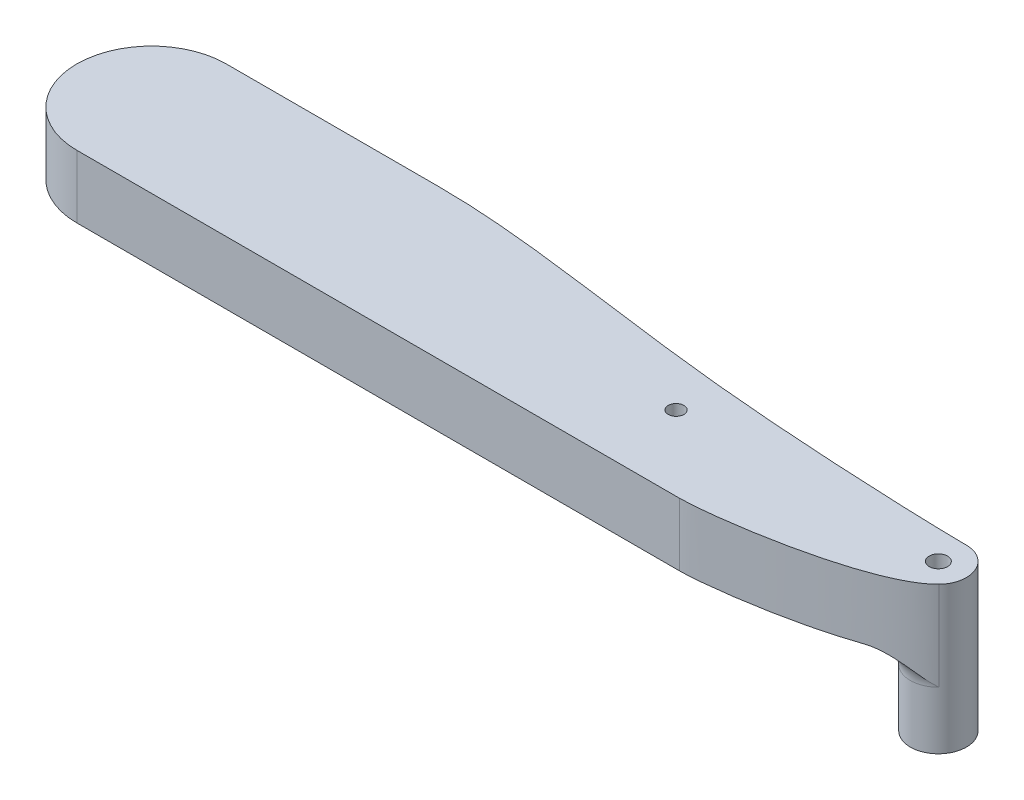
ISO-10303-21;
HEADER;
FILE_DESCRIPTION(('STEP AP214'),'2;1');
FILE_NAME('part.step','',(''),(''),'','','');
FILE_SCHEMA(('AUTOMOTIVE_DESIGN { 1 0 10303 214 1 1 1 1 }'));
ENDSEC;
DATA;
#1=APPLICATION_CONTEXT('core data for automotive mechanical design processes');
#2=APPLICATION_PROTOCOL_DEFINITION('international standard','automotive_design',2000,#1);
#3=PRODUCT_CONTEXT('',#1,'mechanical');
#4=PRODUCT('Part','Part','',(#3));
#5=PRODUCT_RELATED_PRODUCT_CATEGORY('part','',(#4));
#6=PRODUCT_DEFINITION_FORMATION('','',#4);
#7=PRODUCT_DEFINITION_CONTEXT('part definition',#1,'design');
#8=PRODUCT_DEFINITION('design','',#6,#7);
#9=PRODUCT_DEFINITION_SHAPE('','',#8);
#10=(LENGTH_UNIT() NAMED_UNIT(*) SI_UNIT(.MILLI.,.METRE.));
#11=(NAMED_UNIT(*) PLANE_ANGLE_UNIT() SI_UNIT($,.RADIAN.));
#12=(NAMED_UNIT(*) SI_UNIT($,.STERADIAN.) SOLID_ANGLE_UNIT());
#13=UNCERTAINTY_MEASURE_WITH_UNIT(LENGTH_MEASURE(1.E-05),#10,'distance_accuracy_value','');
#14=(GEOMETRIC_REPRESENTATION_CONTEXT(3) GLOBAL_UNCERTAINTY_ASSIGNED_CONTEXT((#13)) GLOBAL_UNIT_ASSIGNED_CONTEXT((#10,
#11,#12)) REPRESENTATION_CONTEXT('',''));
#15=CARTESIAN_POINT('',(0.,0.,0.));
#16=DIRECTION('',(0.,0.,1.));
#17=DIRECTION('',(1.,0.,0.));
#18=AXIS2_PLACEMENT_3D('',#15,#16,#17);
#19=CARTESIAN_POINT('',(-75.,12.,14.25));
#20=DIRECTION('',(0.,0.,-1.));
#21=DIRECTION('',(-1.,0.,0.));
#22=AXIS2_PLACEMENT_3D('',#19,#20,#21);
#23=PLANE('',#22);
#24=DIRECTION('',(0.,-1.,0.));
#25=VECTOR('',#24,1.);
#26=CARTESIAN_POINT('',(39.9337685956905,12.001,14.25));
#27=LINE('',#26,#25);
#28=CARTESIAN_POINT('',(39.9337685956905,12.,14.25));
#29=VERTEX_POINT('',#28);
#30=CARTESIAN_POINT('',(39.9337685956905,0.,14.25));
#31=VERTEX_POINT('',#30);
#32=EDGE_CURVE('E119',#29,#31,#27,.T.);
#33=ORIENTED_EDGE('',*,*,#32,.F.);
#34=DIRECTION('',(1.,0.,0.));
#35=VECTOR('',#34,1.);
#36=CARTESIAN_POINT('',(-75.,12.,14.25));
#37=LINE('',#36,#35);
#38=CARTESIAN_POINT('',(-75.,12.,14.25));
#39=VERTEX_POINT('',#38);
#40=EDGE_CURVE('E139',#39,#29,#37,.T.);
#41=ORIENTED_EDGE('',*,*,#40,.F.);
#42=DIRECTION('',(0.,-1.,0.));
#43=VECTOR('',#42,1.);
#44=CARTESIAN_POINT('',(-75.,12.,14.25));
#45=LINE('',#44,#43);
#46=CARTESIAN_POINT('',(-75.,0.,14.25));
#47=VERTEX_POINT('',#46);
#48=EDGE_CURVE('E143',#39,#47,#45,.T.);
#49=ORIENTED_EDGE('',*,*,#48,.T.);
#50=DIRECTION('',(1.,0.,0.));
#51=VECTOR('',#50,1.);
#52=CARTESIAN_POINT('',(-75.,0.,14.25));
#53=LINE('',#52,#51);
#54=EDGE_CURVE('E153',#47,#31,#53,.T.);
#55=ORIENTED_EDGE('',*,*,#54,.T.);
#56=EDGE_LOOP('',(#33,#41,#49,#55));
#57=FACE_BOUND('',#56,.T.);
#58=ADVANCED_FACE('F45',(#57),#23,.F.);
#59=CARTESIAN_POINT('',(-75.,12.,-14.25));
#60=DIRECTION('',(0.,0.,-1.));
#61=DIRECTION('',(-1.,0.,0.));
#62=AXIS2_PLACEMENT_3D('',#59,#60,#61);
#63=PLANE('',#62);
#64=DIRECTION('',(1.,0.,0.));
#65=VECTOR('',#64,1.);
#66=CARTESIAN_POINT('',(-75.,12.,-14.25));
#67=LINE('',#66,#65);
#68=CARTESIAN_POINT('',(-75.,12.,-14.25));
#69=VERTEX_POINT('',#68);
#70=CARTESIAN_POINT('',(-34.5980224377259,12.,-14.25));
#71=VERTEX_POINT('',#70);
#72=EDGE_CURVE('E129',#69,#71,#67,.T.);
#73=ORIENTED_EDGE('',*,*,#72,.T.);
#74=DIRECTION('',(0.,-1.,0.));
#75=VECTOR('',#74,1.);
#76=CARTESIAN_POINT('',(-34.5980224377259,12.001,-14.25));
#77=LINE('',#76,#75);
#78=CARTESIAN_POINT('',(-34.5980224377259,0.,-14.25));
#79=VERTEX_POINT('',#78);
#80=EDGE_CURVE('E108',#71,#79,#77,.T.);
#81=ORIENTED_EDGE('',*,*,#80,.T.);
#82=DIRECTION('',(1.,0.,0.));
#83=VECTOR('',#82,1.);
#84=CARTESIAN_POINT('',(-75.,0.,-14.25));
#85=LINE('',#84,#83);
#86=CARTESIAN_POINT('',(-75.,0.,-14.25));
#87=VERTEX_POINT('',#86);
#88=EDGE_CURVE('E158',#87,#79,#85,.T.);
#89=ORIENTED_EDGE('',*,*,#88,.F.);
#90=DIRECTION('',(0.,-1.,0.));
#91=VECTOR('',#90,1.);
#92=CARTESIAN_POINT('',(-75.,12.,-14.25));
#93=LINE('',#92,#91);
#94=EDGE_CURVE('E136',#69,#87,#93,.T.);
#95=ORIENTED_EDGE('',*,*,#94,.F.);
#96=EDGE_LOOP('',(#73,#81,#89,#95));
#97=FACE_BOUND('',#96,.T.);
#98=ADVANCED_FACE('F135',(#97),#63,.T.);
#99=CARTESIAN_POINT('',(-75.,0.,0.));
#100=DIRECTION('',(0.,1.,0.));
#101=DIRECTION('',(0.,0.,1.));
#102=AXIS2_PLACEMENT_3D('',#99,#100,#101);
#103=PLANE('',#102);
#104=CARTESIAN_POINT('',(25.,0.,0.));
#105=DIRECTION('',(0.,1.,0.));
#106=DIRECTION('',(0.,0.,1.));
#107=AXIS2_PLACEMENT_3D('',#104,#105,#106);
#108=CIRCLE('',#107,1.5);
#109=CARTESIAN_POINT('',(25.,0.,1.5));
#110=VERTEX_POINT('',#109);
#111=EDGE_CURVE('E154',#110,#110,#108,.T.);
#112=ORIENTED_EDGE('',*,*,#111,.T.);
#113=EDGE_LOOP('',(#112));
#114=FACE_BOUND('',#113,.T.);
#115=CARTESIAN_POINT('',(-34.5980224377259,0.,-14.25));
#116=CARTESIAN_POINT('',(-16.7114247665398,0.,-14.25));
#117=CARTESIAN_POINT('',(16.9697721095391,0.,-7.11576395128839));
#118=CARTESIAN_POINT('',(68.5171140852767,0.,-5.35000000000002));
#119=CARTESIAN_POINT('',(75.,0.,-5.35000000000002));
#120=B_SPLINE_CURVE_WITH_KNOTS('',3,(#115,#116,#117,#118,#119),.UNSPECIFIED.,.F.,.F.,(4,1,4),
(0.,0.557363476483602,1.),.UNSPECIFIED.);
#121=CARTESIAN_POINT('',(66.2551672184016,0.,-5.53628030557362));
#122=VERTEX_POINT('',#121);
#123=EDGE_CURVE('E113',#79,#122,#120,.T.);
#124=ORIENTED_EDGE('',*,*,#123,.T.);
#125=CARTESIAN_POINT('',(75.,0.,0.));
#126=DIRECTION('',(0.,1.,0.));
#127=DIRECTION('',(0.,0.,1.));
#128=AXIS2_PLACEMENT_3D('',#125,#126,#127);
#129=CIRCLE('',#128,10.35);
#130=CARTESIAN_POINT('',(69.4691233137273,0.,8.74825142992844));
#131=VERTEX_POINT('',#130);
#132=EDGE_CURVE('E73',#122,#131,#129,.T.);
#133=ORIENTED_EDGE('',*,*,#132,.T.);
#134=CARTESIAN_POINT('',(78.8479561308971,0.,3.71695219429728));
#135=CARTESIAN_POINT('',(76.072393782244,0.,6.5903392054546));
#136=CARTESIAN_POINT('',(61.3499696988219,0.,12.0828531777784));
#137=CARTESIAN_POINT('',(43.7106323264205,0.,14.25));
#138=CARTESIAN_POINT('',(39.9337685956905,0.,14.25));
#139=B_SPLINE_CURVE_WITH_KNOTS('',3,(#134,#135,#136,#137,#138),.UNSPECIFIED.,.F.,.F.,(4,1,4),
(0.,0.424659955547958,1.),.UNSPECIFIED.);
#140=EDGE_CURVE('E190',#131,#31,#139,.T.);
#141=ORIENTED_EDGE('',*,*,#140,.T.);
#142=ORIENTED_EDGE('',*,*,#54,.F.);
#143=CARTESIAN_POINT('',(-75.,0.,0.));
#144=DIRECTION('',(0.,1.,0.));
#145=DIRECTION('',(0.,0.,1.));
#146=AXIS2_PLACEMENT_3D('',#143,#144,#145);
#147=CIRCLE('',#146,14.25);
#148=EDGE_CURVE('E149',#87,#47,#147,.T.);
#149=ORIENTED_EDGE('',*,*,#148,.F.);
#150=ORIENTED_EDGE('',*,*,#88,.T.);
#151=EDGE_LOOP('',(#124,#133,#141,#142,#149,#150));
#152=FACE_BOUND('',#151,.T.);
#153=ADVANCED_FACE('F270',(#114,#152),#103,.F.);
#154=CARTESIAN_POINT('',(-75.,12.,0.));
#155=DIRECTION('',(0.,-1.,0.));
#156=DIRECTION('',(0.,0.,-1.));
#157=AXIS2_PLACEMENT_3D('',#154,#155,#156);
#158=CYLINDRICAL_SURFACE('',#157,14.25);
#159=ORIENTED_EDGE('',*,*,#148,.T.);
#160=ORIENTED_EDGE('',*,*,#48,.F.);
#161=CARTESIAN_POINT('',(-75.,12.,0.));
#162=DIRECTION('',(0.,1.,0.));
#163=DIRECTION('',(0.,0.,1.));
#164=AXIS2_PLACEMENT_3D('',#161,#162,#163);
#165=CIRCLE('',#164,14.25);
#166=EDGE_CURVE('E145',#69,#39,#165,.T.);
#167=ORIENTED_EDGE('',*,*,#166,.F.);
#168=ORIENTED_EDGE('',*,*,#94,.T.);
#169=EDGE_LOOP('',(#159,#160,#167,#168));
#170=FACE_BOUND('',#169,.T.);
#171=ADVANCED_FACE('F239',(#170),#158,.T.);
#172=CARTESIAN_POINT('',(-75.,12.,0.));
#173=DIRECTION('',(0.,1.,0.));
#174=DIRECTION('',(0.,0.,1.));
#175=AXIS2_PLACEMENT_3D('',#172,#173,#174);
#176=PLANE('',#175);
#177=ORIENTED_EDGE('',*,*,#40,.T.);
#178=CARTESIAN_POINT('',(78.8479561308971,12.,3.71695219429728));
#179=CARTESIAN_POINT('',(76.072393782244,12.,6.5903392054546));
#180=CARTESIAN_POINT('',(61.3499696988219,12.,12.0828531777784));
#181=CARTESIAN_POINT('',(43.7106323264205,12.,14.25));
#182=CARTESIAN_POINT('',(39.9337685956905,12.,14.25));
#183=B_SPLINE_CURVE_WITH_KNOTS('',3,(#178,#179,#180,#181,#182),.UNSPECIFIED.,.F.,.F.,(4,1,4),
(0.,0.424659955547958,1.),.UNSPECIFIED.);
#184=CARTESIAN_POINT('',(78.8479561308971,12.,3.71695219429727));
#185=VERTEX_POINT('',#184);
#186=EDGE_CURVE('E133',#185,#29,#183,.T.);
#187=ORIENTED_EDGE('',*,*,#186,.F.);
#188=CARTESIAN_POINT('',(75.,12.,0.));
#189=DIRECTION('',(0.,1.,0.));
#190=DIRECTION('',(0.,0.,1.));
#191=AXIS2_PLACEMENT_3D('',#188,#189,#190);
#192=CIRCLE('',#191,5.35);
#193=CARTESIAN_POINT('',(75.,12.,-5.35000000000002));
#194=VERTEX_POINT('',#193);
#195=EDGE_CURVE('E131',#185,#194,#192,.T.);
#196=ORIENTED_EDGE('',*,*,#195,.T.);
#197=CARTESIAN_POINT('',(-34.5980224377259,12.,-14.25));
#198=CARTESIAN_POINT('',(-16.7114247665398,12.,-14.25));
#199=CARTESIAN_POINT('',(16.9697721095391,12.,-7.11576395128839));
#200=CARTESIAN_POINT('',(68.5171140852767,12.,-5.35000000000002));
#201=CARTESIAN_POINT('',(75.,12.,-5.35000000000002));
#202=B_SPLINE_CURVE_WITH_KNOTS('',3,(#197,#198,#199,#200,#201),.UNSPECIFIED.,.F.,.F.,(4,1,4),
(0.,0.557363476483602,1.),.UNSPECIFIED.);
#203=EDGE_CURVE('E111',#71,#194,#202,.T.);
#204=ORIENTED_EDGE('',*,*,#203,.F.);
#205=ORIENTED_EDGE('',*,*,#72,.F.);
#206=ORIENTED_EDGE('',*,*,#166,.T.);
#207=EDGE_LOOP('',(#177,#187,#196,#204,#205,#206));
#208=FACE_BOUND('',#207,.T.);
#209=CARTESIAN_POINT('',(75.,12.,0.));
#210=DIRECTION('',(0.,1.,0.));
#211=DIRECTION('',(0.,0.,1.));
#212=AXIS2_PLACEMENT_3D('',#209,#210,#211);
#213=CIRCLE('',#212,1.75);
#214=CARTESIAN_POINT('',(75.,12.,1.74999999999997));
#215=VERTEX_POINT('',#214);
#216=EDGE_CURVE('E218',#215,#215,#213,.F.);
#217=ORIENTED_EDGE('',*,*,#216,.T.);
#218=EDGE_LOOP('',(#217));
#219=FACE_BOUND('',#218,.T.);
#220=CARTESIAN_POINT('',(25.,12.,0.));
#221=DIRECTION('',(0.,1.,0.));
#222=DIRECTION('',(0.,0.,1.));
#223=AXIS2_PLACEMENT_3D('',#220,#221,#222);
#224=CIRCLE('',#223,1.5);
#225=CARTESIAN_POINT('',(25.,12.,1.5));
#226=VERTEX_POINT('',#225);
#227=EDGE_CURVE('E230',#226,#226,#224,.T.);
#228=ORIENTED_EDGE('',*,*,#227,.F.);
#229=EDGE_LOOP('',(#228));
#230=FACE_BOUND('',#229,.T.);
#231=ADVANCED_FACE('F126',(#208,#219,#230),#176,.T.);
#232=CARTESIAN_POINT('',(25.,0.,0.));
#233=DIRECTION('',(0.,1.,0.));
#234=DIRECTION('',(0.,0.,1.));
#235=AXIS2_PLACEMENT_3D('',#232,#233,#234);
#236=CYLINDRICAL_SURFACE('',#235,1.5);
#237=ORIENTED_EDGE('',*,*,#111,.F.);
#238=EDGE_LOOP('',(#237));
#239=FACE_BOUND('',#238,.T.);
#240=ORIENTED_EDGE('',*,*,#227,.T.);
#241=EDGE_LOOP('',(#240));
#242=FACE_BOUND('',#241,.T.);
#243=ADVANCED_FACE('F278',(#239,#242),#236,.F.);
#244=CARTESIAN_POINT('',(75.,-16.,0.));
#245=DIRECTION('',(0.,1.,0.));
#246=DIRECTION('',(0.,0.,1.));
#247=AXIS2_PLACEMENT_3D('',#244,#245,#246);
#248=CYLINDRICAL_SURFACE('',#247,5.35);
#249=CARTESIAN_POINT('',(75.,-16.,0.));
#250=DIRECTION('',(0.,-1.,0.));
#251=DIRECTION('',(0.,0.,-1.));
#252=AXIS2_PLACEMENT_3D('',#249,#250,#251);
#253=CIRCLE('',#252,5.35);
#254=CARTESIAN_POINT('',(75.,-16.,-5.35000000000002));
#255=VERTEX_POINT('',#254);
#256=EDGE_CURVE('E223',#255,#255,#253,.T.);
#257=ORIENTED_EDGE('',*,*,#256,.F.);
#258=EDGE_LOOP('',(#257));
#259=FACE_BOUND('',#258,.T.);
#260=CARTESIAN_POINT('',(75.,-5.,0.));
#261=DIRECTION('',(0.,1.,0.));
#262=DIRECTION('',(0.,0.,1.));
#263=AXIS2_PLACEMENT_3D('',#260,#261,#262);
#264=CIRCLE('',#263,5.35);
#265=CARTESIAN_POINT('',(78.8479561308971,-5.,3.71695219429727));
#266=VERTEX_POINT('',#265);
#267=CARTESIAN_POINT('',(75.,-5.,-5.35000000000002));
#268=VERTEX_POINT('',#267);
#269=EDGE_CURVE('E164',#266,#268,#264,.F.);
#270=ORIENTED_EDGE('',*,*,#269,.T.);
#271=DIRECTION('',(0.,-1.,0.));
#272=VECTOR('',#271,1.);
#273=CARTESIAN_POINT('',(75.,12.001,-5.35000000000002));
#274=LINE('',#273,#272);
#275=EDGE_CURVE('E120',#194,#268,#274,.T.);
#276=ORIENTED_EDGE('',*,*,#275,.F.);
#277=ORIENTED_EDGE('',*,*,#195,.F.);
#278=DIRECTION('',(0.,-1.,0.));
#279=VECTOR('',#278,1.);
#280=CARTESIAN_POINT('',(78.8479561308971,12.001,3.71695219429727));
#281=LINE('',#280,#279);
#282=EDGE_CURVE('E205',#185,#266,#281,.T.);
#283=ORIENTED_EDGE('',*,*,#282,.T.);
#284=EDGE_LOOP('',(#270,#276,#277,#283));
#285=FACE_BOUND('',#284,.T.);
#286=ADVANCED_FACE('F259',(#259,#285),#248,.T.);
#287=CARTESIAN_POINT('',(75.,-16.,0.));
#288=DIRECTION('',(0.,-1.,0.));
#289=DIRECTION('',(0.,0.,-1.));
#290=AXIS2_PLACEMENT_3D('',#287,#288,#289);
#291=PLANE('',#290);
#292=CARTESIAN_POINT('',(75.,-16.,0.));
#293=DIRECTION('',(0.,-1.,0.));
#294=DIRECTION('',(0.,0.,-1.));
#295=AXIS2_PLACEMENT_3D('',#292,#293,#294);
#296=CIRCLE('',#295,1.75);
#297=CARTESIAN_POINT('',(75.,-16.,-1.75000000000002));
#298=VERTEX_POINT('',#297);
#299=EDGE_CURVE('E219',#298,#298,#296,.T.);
#300=ORIENTED_EDGE('',*,*,#299,.F.);
#301=EDGE_LOOP('',(#300));
#302=FACE_BOUND('',#301,.T.);
#303=ORIENTED_EDGE('',*,*,#256,.T.);
#304=EDGE_LOOP('',(#303));
#305=FACE_BOUND('',#304,.T.);
#306=ADVANCED_FACE('F289',(#302,#305),#291,.T.);
#307=CARTESIAN_POINT('',(75.,12.001,0.));
#308=DIRECTION('',(0.,-1.,0.));
#309=DIRECTION('',(0.,0.,-1.));
#310=AXIS2_PLACEMENT_3D('',#307,#308,#309);
#311=CYLINDRICAL_SURFACE('',#310,1.75);
#312=ORIENTED_EDGE('',*,*,#216,.F.);
#313=EDGE_LOOP('',(#312));
#314=FACE_BOUND('',#313,.T.);
#315=ORIENTED_EDGE('',*,*,#299,.T.);
#316=EDGE_LOOP('',(#315));
#317=FACE_BOUND('',#316,.T.);
#318=ADVANCED_FACE('F292',(#314,#317),#311,.F.);
#319=CARTESIAN_POINT('',(78.8479561308971,12.001,3.71695219429728));
#320=CARTESIAN_POINT('',(76.072393782244,12.001,6.5903392054546));
#321=CARTESIAN_POINT('',(61.3499696988219,12.001,12.0828531777784));
#322=CARTESIAN_POINT('',(43.7106323264205,12.001,14.25));
#323=CARTESIAN_POINT('',(39.9337685956905,12.001,14.25));
#324=B_SPLINE_CURVE_WITH_KNOTS('',3,(#319,#320,#321,#322,#323),.UNSPECIFIED.,.F.,.F.,(4,1,4),
(0.,0.424659955547958,1.),.UNSPECIFIED.);
#325=DIRECTION('',(0.,-1.,0.));
#326=VECTOR('',#325,1.);
#327=SURFACE_OF_LINEAR_EXTRUSION('',#324,#326);
#328=ORIENTED_EDGE('',*,*,#186,.T.);
#329=ORIENTED_EDGE('',*,*,#32,.T.);
#330=ORIENTED_EDGE('',*,*,#140,.F.);
#331=CARTESIAN_POINT('',(69.4691233137273,0.,8.74825142992843));
#332=CARTESIAN_POINT('',(69.7162407882261,1.27748011089044E-05,8.66245437018305));
#333=CARTESIAN_POINT('',(69.962607833802,-0.0125491171100913,8.5750943704054));
#334=CARTESIAN_POINT('',(70.4517020973876,-0.0605992398901933,8.39780159957875));
#335=CARTESIAN_POINT('',(70.6944349001187,-0.0960475630018742,8.30787356687456));
#336=CARTESIAN_POINT('',(71.1718444173524,-0.187062457598344,8.12689029729101));
#337=CARTESIAN_POINT('',(71.4065850184377,-0.242359307322953,8.03586527413671));
#338=CARTESIAN_POINT('',(71.8703242354992,-0.371039394806027,7.85175522217878));
#339=CARTESIAN_POINT('',(72.0993197194223,-0.444432271604344,7.75866911965029));
#340=CARTESIAN_POINT('',(72.674878457881,-0.651986117625769,7.51888775781213));
#341=CARTESIAN_POINT('',(73.0168554919735,-0.79737155609047,7.37085778621921));
#342=CARTESIAN_POINT('',(73.6837880315598,-1.11900178064741,7.07018502336122));
#343=CARTESIAN_POINT('',(74.0087346410547,-1.29526249004823,6.91753988568995));
#344=CARTESIAN_POINT('',(74.6434955543207,-1.67234957347358,6.60592836092759));
#345=CARTESIAN_POINT('',(74.9532186930552,-1.8733034321054,6.44693229645299));
#346=CARTESIAN_POINT('',(75.5568759828669,-2.291814993449,6.12150429630458));
#347=CARTESIAN_POINT('',(75.850813750054,-2.50936886555008,5.95507407978502));
#348=CARTESIAN_POINT('',(76.3796138184038,-2.91895253401379,5.63853837748122));
#349=CARTESIAN_POINT('',(76.6164869748891,-3.10960306354123,5.48999244960261));
#350=CARTESIAN_POINT('',(76.9649894689786,-3.39705063835818,5.25933946851062));
#351=CARTESIAN_POINT('',(77.0799359553171,-3.4930368201799,5.18121304727183));
#352=CARTESIAN_POINT('',(77.3077128325651,-3.68492409096186,5.02182045700902));
#353=CARTESIAN_POINT('',(77.42054321641,-3.780825179637,4.94055427750582));
#354=CARTESIAN_POINT('',(77.6332741862816,-3.96259175822071,4.78237447157961));
#355=CARTESIAN_POINT('',(77.7333676662822,-4.04852867841347,4.70580286732091));
#356=CARTESIAN_POINT('',(77.931808499013,-4.21919635947676,4.54913752120436));
#357=CARTESIAN_POINT('',(78.0301559521029,-4.30392718961627,4.4690439827098));
#358=CARTESIAN_POINT('',(78.2249537480483,-4.47149372823809,4.30477466558149));
#359=CARTESIAN_POINT('',(78.3214048379879,-4.55433018520727,4.22060054172524));
#360=CARTESIAN_POINT('',(78.5122076748602,-4.71734715723012,4.04745761662808));
#361=CARTESIAN_POINT('',(78.6065598700382,-4.79752824119479,3.95848985329122));
#362=CARTESIAN_POINT('',(78.7444834165377,-4.91361799665276,3.82253296724096));
#363=CARTESIAN_POINT('',(78.7890128150325,-4.9509209245226,3.77770258463589));
#364=CARTESIAN_POINT('',(78.838136520212,-4.99183054163257,3.7271049515491));
#365=CARTESIAN_POINT('',(78.8430483354545,-4.9959183281715,3.72203296145574));
#366=CARTESIAN_POINT('',(78.8479561308971,-5.,3.71695219429726));
#367=B_SPLINE_CURVE_WITH_KNOTS('',3,(#331,#332,#333,#334,#335,#336,#337,#338,#339,#340,#341,
#342,#343,#344,#345,#346,#347,#348,#349,#350,#351,#352,#353,#354,#355,#356,#357,#358,#359,#360,
#361,#362,#363,#364,#365,#366),.UNSPECIFIED.,.F.,.F.,(4,2,2,2,2,2,2,2,2,2,2,2,2,2,2,2,2,4),(0.,
0.784171888015648,1.56698007158472,2.33953014215247,3.11249261204731,4.31045412731768,
5.50903529631684,6.71408720536131,7.91886187335508,8.93381135105707,9.44050116631584,
9.94719267283744,10.4047534731159,10.8622878875534,11.3196382878058,11.7768900588007,
11.9969988565836,12.0214743085639),.UNSPECIFIED.);
#368=EDGE_CURVE('E11',#131,#266,#367,.T.);
#369=ORIENTED_EDGE('',*,*,#368,.T.);
#370=ORIENTED_EDGE('',*,*,#282,.F.);
#371=EDGE_LOOP('',(#328,#329,#330,#369,#370));
#372=FACE_BOUND('',#371,.T.);
#373=ADVANCED_FACE('F178',(#372),#327,.T.);
#374=CARTESIAN_POINT('',(-34.5980224377259,12.001,-14.25));
#375=CARTESIAN_POINT('',(-16.7114247665398,12.001,-14.25));
#376=CARTESIAN_POINT('',(16.9697721095391,12.001,-7.11576395128839));
#377=CARTESIAN_POINT('',(68.5171140852767,12.001,-5.35000000000002));
#378=CARTESIAN_POINT('',(75.,12.001,-5.35000000000002));
#379=B_SPLINE_CURVE_WITH_KNOTS('',3,(#374,#375,#376,#377,#378),.UNSPECIFIED.,.F.,.F.,(4,1,4),
(0.,0.557363476483602,1.),.UNSPECIFIED.);
#380=DIRECTION('',(0.,-1.,0.));
#381=VECTOR('',#380,1.);
#382=SURFACE_OF_LINEAR_EXTRUSION('',#379,#381);
#383=ORIENTED_EDGE('',*,*,#203,.T.);
#384=ORIENTED_EDGE('',*,*,#275,.T.);
#385=CARTESIAN_POINT('',(66.2551672184016,0.,-5.53628030557362));
#386=CARTESIAN_POINT('',(66.469171831673,2.7526163092675E-05,-5.52934133624696));
#387=CARTESIAN_POINT('',(66.6830549370466,-0.0102103952886642,-5.52252599978187));
#388=CARTESIAN_POINT('',(67.1087483131879,-0.0497849331220507,-5.50920403246953));
#389=CARTESIAN_POINT('',(67.3205612326467,-0.0790926014635715,-5.5026969497263));
#390=CARTESIAN_POINT('',(67.7384270571091,-0.154926514796708,-5.49010736517336));
#391=CARTESIAN_POINT('',(67.944518556504,-0.201242564127938,-5.48402071511977));
#392=CARTESIAN_POINT('',(68.352578429492,-0.309675501481573,-5.47221630833354));
#393=CARTESIAN_POINT('',(68.5545447666986,-0.371799998976676,-5.46649873092214));
#394=CARTESIAN_POINT('',(69.0330971758725,-0.537997136532007,-5.45325233210289));
#395=CARTESIAN_POINT('',(69.3073184984908,-0.648918143188869,-5.44591058454164));
#396=CARTESIAN_POINT('',(69.8448032783703,-0.894670916389738,-5.43201873464776));
#397=CARTESIAN_POINT('',(70.1080631275786,-1.02951048027828,-5.42546889164696));
#398=CARTESIAN_POINT('',(70.6245680152153,-1.31988739492585,-5.41313052751293));
#399=CARTESIAN_POINT('',(70.8777566397963,-1.47552449365025,-5.40734596092998));
#400=CARTESIAN_POINT('',(71.3732791139093,-1.8033382062679,-5.39656186574452));
#401=CARTESIAN_POINT('',(71.6156078060463,-1.9755225589412,-5.39156270736782));
#402=CARTESIAN_POINT('',(72.1349079191348,-2.36653434578184,-5.38147489203614));
#403=CARTESIAN_POINT('',(72.4098450834117,-2.58805068278525,-5.37654553585045));
#404=CARTESIAN_POINT('',(72.9482826071423,-3.04443210284386,-5.36779391501464));
#405=CARTESIAN_POINT('',(73.2117830018426,-3.27929714475501,-5.36397164695241));
#406=CARTESIAN_POINT('',(73.7302346768364,-3.75760414501523,-5.35753758705819));
#407=CARTESIAN_POINT('',(73.9851957682214,-4.00103555179908,-5.3549243585361));
#408=CARTESIAN_POINT('',(74.4903377558122,-4.4927358075824,-5.3511711122058));
#409=CARTESIAN_POINT('',(74.7405190309079,-4.7410042699772,-5.35003097714602));
#410=CARTESIAN_POINT('',(74.9933159973708,-4.99332774686762,-5.35000021487235));
#411=CARTESIAN_POINT('',(74.9966580619035,-4.99666381094927,-5.35000000738095));
#412=CARTESIAN_POINT('',(75.,-5.,-5.35000000000003));
#413=B_SPLINE_CURVE_WITH_KNOTS('',3,(#385,#386,#387,#388,#389,#390,#391,#392,#393,#394,#395,
#396,#397,#398,#399,#400,#401,#402,#403,#404,#405,#406,#407,#408,#409,#410,#411,#412),
.UNSPECIFIED.,.F.,.F.,(4,2,2,2,2,2,2,2,2,2,2,2,2,4),(0.,0.641922934771606,1.28287369122424,
1.91615619906444,2.54974411903925,3.43602215968588,4.32258965584178,5.21357303967188,
6.10497516330829,7.16367992520422,8.2223814240844,9.27982162637577,10.3371776560255,
10.3513441117543),.UNSPECIFIED.);
#414=EDGE_CURVE('E60',#268,#122,#413,.F.);
#415=ORIENTED_EDGE('',*,*,#414,.T.);
#416=ORIENTED_EDGE('',*,*,#123,.F.);
#417=ORIENTED_EDGE('',*,*,#80,.F.);
#418=EDGE_LOOP('',(#383,#384,#415,#416,#417));
#419=FACE_BOUND('',#418,.T.);
#420=ADVANCED_FACE('F110',(#419),#382,.T.);
#421=CARTESIAN_POINT('',(75.,-5.,0.));
#422=DIRECTION('',(0.,1.,0.));
#423=DIRECTION('',(0.,0.,1.));
#424=AXIS2_PLACEMENT_3D('',#421,#422,#423);
#425=TOROIDAL_SURFACE('',#424,10.35,5.);
#426=ORIENTED_EDGE('',*,*,#368,.F.);
#427=ORIENTED_EDGE('',*,*,#132,.F.);
#428=ORIENTED_EDGE('',*,*,#414,.F.);
#429=ORIENTED_EDGE('',*,*,#269,.F.);
#430=EDGE_LOOP('',(#426,#427,#428,#429));
#431=FACE_BOUND('',#430,.T.);
#432=ADVANCED_FACE('F47',(#431),#425,.F.);
#433=CLOSED_SHELL('',(#58,#98,#153,#171,#231,#243,#286,#306,#318,#373,#420,#432));
#434=MANIFOLD_SOLID_BREP('B2',#433);
#435=ADVANCED_BREP_SHAPE_REPRESENTATION('',(#18,#434),#14);
#436=SHAPE_DEFINITION_REPRESENTATION(#9,#435);
ENDSEC;
END-ISO-10303-21;
